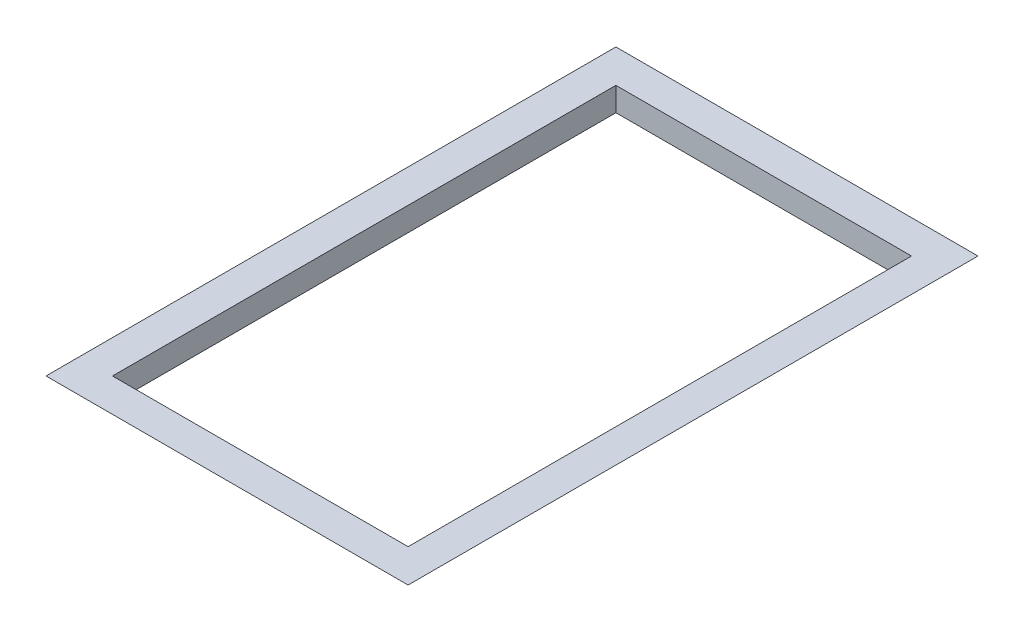
ISO-10303-21;
HEADER;
FILE_DESCRIPTION(('STEP AP214'),'2;1');
FILE_NAME('part.step','',(''),(''),'','','');
FILE_SCHEMA(('AUTOMOTIVE_DESIGN { 1 0 10303 214 1 1 1 1 }'));
ENDSEC;
DATA;
#1=APPLICATION_CONTEXT('core data for automotive mechanical design processes');
#2=APPLICATION_PROTOCOL_DEFINITION('international standard','automotive_design',2000,#1);
#3=PRODUCT_CONTEXT('',#1,'mechanical');
#4=PRODUCT('Part','Part','',(#3));
#5=PRODUCT_RELATED_PRODUCT_CATEGORY('part','',(#4));
#6=PRODUCT_DEFINITION_FORMATION('','',#4);
#7=PRODUCT_DEFINITION_CONTEXT('part definition',#1,'design');
#8=PRODUCT_DEFINITION('design','',#6,#7);
#9=PRODUCT_DEFINITION_SHAPE('','',#8);
#10=(LENGTH_UNIT() NAMED_UNIT(*) SI_UNIT(.MILLI.,.METRE.));
#11=(NAMED_UNIT(*) PLANE_ANGLE_UNIT() SI_UNIT($,.RADIAN.));
#12=(NAMED_UNIT(*) SI_UNIT($,.STERADIAN.) SOLID_ANGLE_UNIT());
#13=UNCERTAINTY_MEASURE_WITH_UNIT(LENGTH_MEASURE(1.E-05),#10,'distance_accuracy_value','');
#14=(GEOMETRIC_REPRESENTATION_CONTEXT(3) GLOBAL_UNCERTAINTY_ASSIGNED_CONTEXT((#13)) GLOBAL_UNIT_ASSIGNED_CONTEXT((#10,
#11,#12)) REPRESENTATION_CONTEXT('',''));
#15=CARTESIAN_POINT('',(0.,0.,0.));
#16=DIRECTION('',(0.,0.,1.));
#17=DIRECTION('',(1.,0.,0.));
#18=AXIS2_PLACEMENT_3D('',#15,#16,#17);
#19=CARTESIAN_POINT('',(0.,0.,0.));
#20=DIRECTION('',(0.,1.,0.));
#21=DIRECTION('',(0.,0.,1.));
#22=AXIS2_PLACEMENT_3D('',#19,#20,#21);
#23=PLANE('',#22);
#24=DIRECTION('',(0.,0.,-1.));
#25=VECTOR('',#24,1.);
#26=CARTESIAN_POINT('',(-3312.49999999999,4.44089209850063E-13,18485.8011696608));
#27=LINE('',#26,#25);
#28=CARTESIAN_POINT('',(-3312.49999999999,0.,5500.));
#29=VERTEX_POINT('',#28);
#30=CARTESIAN_POINT('',(-3312.49999999999,0.,-5499.99999999999));
#31=VERTEX_POINT('',#30);
#32=EDGE_CURVE('E54',#29,#31,#27,.T.);
#33=ORIENTED_EDGE('',*,*,#32,.T.);
#34=DIRECTION('',(-1.,0.,0.));
#35=VECTOR('',#34,1.);
#36=CARTESIAN_POINT('',(19062.9596417098,2.22044604925031E-12,-5500.));
#37=LINE('',#36,#35);
#38=CARTESIAN_POINT('',(3312.49999999999,4.44089209850063E-13,-5500.));
#39=VERTEX_POINT('',#38);
#40=EDGE_CURVE('E312',#39,#31,#37,.T.);
#41=ORIENTED_EDGE('',*,*,#40,.F.);
#42=DIRECTION('',(0.,0.,-1.));
#43=VECTOR('',#42,1.);
#44=CARTESIAN_POINT('',(3312.49999999999,4.44089209850063E-13,18485.8011696608));
#45=LINE('',#44,#43);
#46=CARTESIAN_POINT('',(3312.49999999999,2.22044604925031E-12,5500.));
#47=VERTEX_POINT('',#46);
#48=EDGE_CURVE('E307',#47,#39,#45,.T.);
#49=ORIENTED_EDGE('',*,*,#48,.F.);
#50=DIRECTION('',(-1.,0.,0.));
#51=VECTOR('',#50,1.);
#52=CARTESIAN_POINT('',(19062.9596417098,2.22044604925031E-12,5500.));
#53=LINE('',#52,#51);
#54=EDGE_CURVE('E314',#47,#29,#53,.T.);
#55=ORIENTED_EDGE('',*,*,#54,.T.);
#56=EDGE_LOOP('',(#33,#41,#49,#55));
#57=FACE_BOUND('',#56,.T.);
#58=DIRECTION('',(0.,0.,1.));
#59=VECTOR('',#58,1.);
#60=CARTESIAN_POINT('',(-3112.49999999999,0.,-5300.));
#61=LINE('',#60,#59);
#62=CARTESIAN_POINT('',(-3112.49999999999,0.,-5300.));
#63=VERTEX_POINT('',#62);
#64=CARTESIAN_POINT('',(-3112.49999999999,0.,5300.));
#65=VERTEX_POINT('',#64);
#66=EDGE_CURVE('E178',#63,#65,#61,.T.);
#67=ORIENTED_EDGE('',*,*,#66,.T.);
#68=DIRECTION('',(1.,0.,0.));
#69=VECTOR('',#68,1.);
#70=CARTESIAN_POINT('',(-3112.49999999999,0.,5300.));
#71=LINE('',#70,#69);
#72=CARTESIAN_POINT('',(3112.49999999999,0.,5300.));
#73=VERTEX_POINT('',#72);
#74=EDGE_CURVE('E170',#65,#73,#71,.T.);
#75=ORIENTED_EDGE('',*,*,#74,.T.);
#76=DIRECTION('',(0.,0.,-1.));
#77=VECTOR('',#76,1.);
#78=CARTESIAN_POINT('',(3112.49999999999,0.,-5300.));
#79=LINE('',#78,#77);
#80=CARTESIAN_POINT('',(3112.49999999999,0.,-5300.));
#81=VERTEX_POINT('',#80);
#82=EDGE_CURVE('E162',#73,#81,#79,.T.);
#83=ORIENTED_EDGE('',*,*,#82,.T.);
#84=DIRECTION('',(-1.,0.,0.));
#85=VECTOR('',#84,1.);
#86=CARTESIAN_POINT('',(-3112.49999999999,0.,-5300.));
#87=LINE('',#86,#85);
#88=EDGE_CURVE('E158',#81,#63,#87,.T.);
#89=ORIENTED_EDGE('',*,*,#88,.T.);
#90=EDGE_LOOP('',(#67,#75,#83,#89));
#91=FACE_BOUND('',#90,.T.);
#92=ADVANCED_FACE('F38',(#57,#91),#23,.F.);
#93=CARTESIAN_POINT('',(-3112.49999999999,14717.6167130782,-5300.));
#94=DIRECTION('',(1.,0.,0.));
#95=DIRECTION('',(0.,0.,-1.));
#96=AXIS2_PLACEMENT_3D('',#93,#94,#95);
#97=PLANE('',#96);
#98=DIRECTION('',(0.,0.,-1.));
#99=VECTOR('',#98,1.);
#100=CARTESIAN_POINT('',(-3112.49999999999,500.,-5300.));
#101=LINE('',#100,#99);
#102=CARTESIAN_POINT('',(-3112.49999999999,500.,5300.));
#103=VERTEX_POINT('',#102);
#104=CARTESIAN_POINT('',(-3112.49999999999,500.,-5300.));
#105=VERTEX_POINT('',#104);
#106=EDGE_CURVE('E137',#103,#105,#101,.T.);
#107=ORIENTED_EDGE('',*,*,#106,.F.);
#108=DIRECTION('',(0.,-1.,0.));
#109=VECTOR('',#108,1.);
#110=CARTESIAN_POINT('',(-3112.49999999999,14717.6167130782,5300.));
#111=LINE('',#110,#109);
#112=EDGE_CURVE('E93',#103,#65,#111,.T.);
#113=ORIENTED_EDGE('',*,*,#112,.T.);
#114=ORIENTED_EDGE('',*,*,#66,.F.);
#115=DIRECTION('',(0.,-1.,0.));
#116=VECTOR('',#115,1.);
#117=CARTESIAN_POINT('',(-3112.49999999999,14717.6167130782,-5300.));
#118=LINE('',#117,#116);
#119=EDGE_CURVE('E140',#105,#63,#118,.T.);
#120=ORIENTED_EDGE('',*,*,#119,.F.);
#121=EDGE_LOOP('',(#107,#113,#114,#120));
#122=FACE_BOUND('',#121,.T.);
#123=ADVANCED_FACE('F192',(#122),#97,.T.);
#124=CARTESIAN_POINT('',(-3112.49999999999,14717.6167130782,5300.));
#125=DIRECTION('',(0.,0.,-1.));
#126=DIRECTION('',(-1.,0.,0.));
#127=AXIS2_PLACEMENT_3D('',#124,#125,#126);
#128=PLANE('',#127);
#129=DIRECTION('',(-1.,0.,0.));
#130=VECTOR('',#129,1.);
#131=CARTESIAN_POINT('',(-3112.49999999999,500.,5300.));
#132=LINE('',#131,#130);
#133=CARTESIAN_POINT('',(3112.49999999999,500.,5300.));
#134=VERTEX_POINT('',#133);
#135=EDGE_CURVE('E11',#134,#103,#132,.T.);
#136=ORIENTED_EDGE('',*,*,#135,.F.);
#137=DIRECTION('',(0.,-1.,0.));
#138=VECTOR('',#137,1.);
#139=CARTESIAN_POINT('',(3112.49999999999,14717.6167130782,5300.));
#140=LINE('',#139,#138);
#141=EDGE_CURVE('E154',#134,#73,#140,.T.);
#142=ORIENTED_EDGE('',*,*,#141,.T.);
#143=ORIENTED_EDGE('',*,*,#74,.F.);
#144=ORIENTED_EDGE('',*,*,#112,.F.);
#145=EDGE_LOOP('',(#136,#142,#143,#144));
#146=FACE_BOUND('',#145,.T.);
#147=ADVANCED_FACE('F187',(#146),#128,.T.);
#148=CARTESIAN_POINT('',(3112.49999999999,14717.6167130782,-5300.));
#149=DIRECTION('',(-1.,0.,0.));
#150=DIRECTION('',(0.,0.,1.));
#151=AXIS2_PLACEMENT_3D('',#148,#149,#150);
#152=PLANE('',#151);
#153=DIRECTION('',(0.,0.,1.));
#154=VECTOR('',#153,1.);
#155=CARTESIAN_POINT('',(3112.49999999999,500.,-5300.));
#156=LINE('',#155,#154);
#157=CARTESIAN_POINT('',(3112.49999999999,500.,-5300.));
#158=VERTEX_POINT('',#157);
#159=EDGE_CURVE('E42',#158,#134,#156,.T.);
#160=ORIENTED_EDGE('',*,*,#159,.F.);
#161=DIRECTION('',(0.,-1.,0.));
#162=VECTOR('',#161,1.);
#163=CARTESIAN_POINT('',(3112.49999999999,14717.6167130782,-5300.));
#164=LINE('',#163,#162);
#165=EDGE_CURVE('E147',#158,#81,#164,.T.);
#166=ORIENTED_EDGE('',*,*,#165,.T.);
#167=ORIENTED_EDGE('',*,*,#82,.F.);
#168=ORIENTED_EDGE('',*,*,#141,.F.);
#169=EDGE_LOOP('',(#160,#166,#167,#168));
#170=FACE_BOUND('',#169,.T.);
#171=ADVANCED_FACE('F190',(#170),#152,.T.);
#172=CARTESIAN_POINT('',(-3112.49999999999,14717.6167130782,-5300.));
#173=DIRECTION('',(0.,0.,1.));
#174=DIRECTION('',(1.,0.,0.));
#175=AXIS2_PLACEMENT_3D('',#172,#173,#174);
#176=PLANE('',#175);
#177=DIRECTION('',(1.,0.,0.));
#178=VECTOR('',#177,1.);
#179=CARTESIAN_POINT('',(-3112.49999999999,500.,-5300.));
#180=LINE('',#179,#178);
#181=EDGE_CURVE('E139',#105,#158,#180,.T.);
#182=ORIENTED_EDGE('',*,*,#181,.F.);
#183=ORIENTED_EDGE('',*,*,#119,.T.);
#184=ORIENTED_EDGE('',*,*,#88,.F.);
#185=ORIENTED_EDGE('',*,*,#165,.F.);
#186=EDGE_LOOP('',(#182,#183,#184,#185));
#187=FACE_BOUND('',#186,.T.);
#188=ADVANCED_FACE('F193',(#187),#176,.T.);
#189=CARTESIAN_POINT('',(-4812.49999999999,500.,18485.8011696608));
#190=DIRECTION('',(0.,-1.,0.));
#191=DIRECTION('',(0.,0.,-1.));
#192=AXIS2_PLACEMENT_3D('',#189,#190,#191);
#193=PLANE('',#192);
#194=ORIENTED_EDGE('',*,*,#106,.T.);
#195=ORIENTED_EDGE('',*,*,#181,.T.);
#196=ORIENTED_EDGE('',*,*,#159,.T.);
#197=ORIENTED_EDGE('',*,*,#135,.T.);
#198=EDGE_LOOP('',(#194,#195,#196,#197));
#199=FACE_BOUND('',#198,.T.);
#200=DIRECTION('',(1.,0.,0.));
#201=VECTOR('',#200,1.);
#202=CARTESIAN_POINT('',(3812.49999999999,500.,-6000.));
#203=LINE('',#202,#201);
#204=CARTESIAN_POINT('',(-3812.49999999999,500.,-6000.));
#205=VERTEX_POINT('',#204);
#206=CARTESIAN_POINT('',(3812.49999999999,500.,-6000.));
#207=VERTEX_POINT('',#206);
#208=EDGE_CURVE('E129',#205,#207,#203,.T.);
#209=ORIENTED_EDGE('',*,*,#208,.F.);
#210=DIRECTION('',(0.,0.,-1.));
#211=VECTOR('',#210,1.);
#212=CARTESIAN_POINT('',(-3812.49999999999,500.,-6000.));
#213=LINE('',#212,#211);
#214=CARTESIAN_POINT('',(-3812.49999999999,500.000000000002,5999.99999999999));
#215=VERTEX_POINT('',#214);
#216=EDGE_CURVE('E115',#215,#205,#213,.T.);
#217=ORIENTED_EDGE('',*,*,#216,.F.);
#218=DIRECTION('',(-1.,0.,0.));
#219=VECTOR('',#218,1.);
#220=CARTESIAN_POINT('',(-3812.49999999999,500.,5999.99999999999));
#221=LINE('',#220,#219);
#222=CARTESIAN_POINT('',(3812.5,500.,5999.99999999999));
#223=VERTEX_POINT('',#222);
#224=EDGE_CURVE('E123',#223,#215,#221,.T.);
#225=ORIENTED_EDGE('',*,*,#224,.F.);
#226=DIRECTION('',(0.,0.,1.));
#227=VECTOR('',#226,1.);
#228=CARTESIAN_POINT('',(3812.49999999999,500.,5999.99999999999));
#229=LINE('',#228,#227);
#230=EDGE_CURVE('E63',#207,#223,#229,.T.);
#231=ORIENTED_EDGE('',*,*,#230,.F.);
#232=EDGE_LOOP('',(#209,#217,#225,#231));
#233=FACE_BOUND('',#232,.T.);
#234=ADVANCED_FACE('F40',(#199,#233),#193,.F.);
#235=CARTESIAN_POINT('',(-3812.49999999999,500.,18485.8011696608));
#236=DIRECTION('',(-0.707106781186549,-0.707106781186546,0.));
#237=DIRECTION('',(0.707106781186546,-0.707106781186549,0.));
#238=AXIS2_PLACEMENT_3D('',#235,#236,#237);
#239=PLANE('',#238);
#240=ORIENTED_EDGE('',*,*,#216,.T.);
#241=DIRECTION('',(-0.577350269189623,0.577350269189626,-0.577350269189628));
#242=VECTOR('',#241,1.);
#243=CARTESIAN_POINT('',(4349.43372322028,-7661.93372322032,2161.93372322034));
#244=LINE('',#243,#242);
#245=EDGE_CURVE('E98',#31,#205,#244,.T.);
#246=ORIENTED_EDGE('',*,*,#245,.F.);
#247=ORIENTED_EDGE('',*,*,#32,.F.);
#248=DIRECTION('',(0.577350269189624,-0.577350269189627,-0.577350269189626));
#249=VECTOR('',#248,1.);
#250=CARTESIAN_POINT('',(-7974.43372322026,4661.93372322029,10161.9337232203));
#251=LINE('',#250,#249);
#252=EDGE_CURVE('E111',#215,#29,#251,.T.);
#253=ORIENTED_EDGE('',*,*,#252,.F.);
#254=EDGE_LOOP('',(#240,#246,#247,#253));
#255=FACE_BOUND('',#254,.T.);
#256=ADVANCED_FACE('F113',(#255),#239,.T.);
#257=CARTESIAN_POINT('',(3312.49999999999,4.44089209850063E-13,18485.8011696608));
#258=DIRECTION('',(0.707106781186549,-0.707106781186546,0.));
#259=DIRECTION('',(0.707106781186546,0.707106781186549,0.));
#260=AXIS2_PLACEMENT_3D('',#257,#258,#259);
#261=PLANE('',#260);
#262=ORIENTED_EDGE('',*,*,#48,.T.);
#263=DIRECTION('',(-0.577350269189624,-0.577350269189626,0.577350269189628));
#264=VECTOR('',#263,1.);
#265=CARTESIAN_POINT('',(-4682.76705655361,-7995.26705655364,2495.26705655367));
#266=LINE('',#265,#264);
#267=EDGE_CURVE('E309',#207,#39,#266,.T.);
#268=ORIENTED_EDGE('',*,*,#267,.F.);
#269=ORIENTED_EDGE('',*,*,#230,.T.);
#270=DIRECTION('',(0.577350269189625,0.577350269189627,0.577350269189625));
#271=VECTOR('',#270,1.);
#272=CARTESIAN_POINT('',(7641.10038988693,4328.60038988695,9828.60038988693));
#273=LINE('',#272,#271);
#274=EDGE_CURVE('E125',#47,#223,#273,.T.);
#275=ORIENTED_EDGE('',*,*,#274,.F.);
#276=EDGE_LOOP('',(#262,#268,#269,#275));
#277=FACE_BOUND('',#276,.T.);
#278=ADVANCED_FACE('F203',(#277),#261,.T.);
#279=CARTESIAN_POINT('',(19062.9596417098,500.000000000002,-6000.));
#280=DIRECTION('',(0.,0.707106781186549,0.707106781186546));
#281=DIRECTION('',(0.,-0.707106781186546,0.707106781186549));
#282=AXIS2_PLACEMENT_3D('',#279,#280,#281);
#283=PLANE('',#282);
#284=ORIENTED_EDGE('',*,*,#245,.T.);
#285=ORIENTED_EDGE('',*,*,#208,.T.);
#286=ORIENTED_EDGE('',*,*,#267,.T.);
#287=ORIENTED_EDGE('',*,*,#40,.T.);
#288=EDGE_LOOP('',(#284,#285,#286,#287));
#289=FACE_BOUND('',#288,.T.);
#290=ADVANCED_FACE('F250',(#289),#283,.F.);
#291=CARTESIAN_POINT('',(19062.9596417098,2.22044604925031E-12,5500.));
#292=DIRECTION('',(0.,0.707106781186546,-0.707106781186549));
#293=DIRECTION('',(0.,0.707106781186549,0.707106781186546));
#294=AXIS2_PLACEMENT_3D('',#291,#292,#293);
#295=PLANE('',#294);
#296=ORIENTED_EDGE('',*,*,#252,.T.);
#297=ORIENTED_EDGE('',*,*,#54,.F.);
#298=ORIENTED_EDGE('',*,*,#274,.T.);
#299=ORIENTED_EDGE('',*,*,#224,.T.);
#300=EDGE_LOOP('',(#296,#297,#298,#299));
#301=FACE_BOUND('',#300,.T.);
#302=ADVANCED_FACE('F124',(#301),#295,.F.);
#303=CLOSED_SHELL('',(#92,#123,#147,#171,#188,#234,#256,#278,#290,#302));
#304=MANIFOLD_SOLID_BREP('B2',#303);
#305=ADVANCED_BREP_SHAPE_REPRESENTATION('',(#18,#304),#14);
#306=SHAPE_DEFINITION_REPRESENTATION(#9,#305);
ENDSEC;
END-ISO-10303-21;
